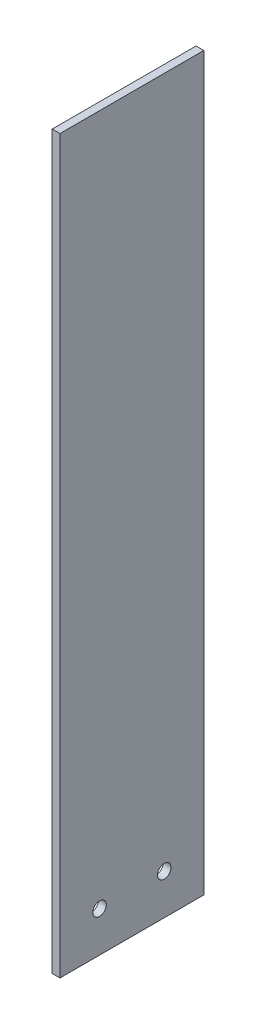
ISO-10303-21;
HEADER;
FILE_DESCRIPTION(('STEP AP214'),'2;1');
FILE_NAME('part.step','',(''),(''),'','','');
FILE_SCHEMA(('AUTOMOTIVE_DESIGN { 1 0 10303 214 1 1 1 1 }'));
ENDSEC;
DATA;
#1=APPLICATION_CONTEXT('core data for automotive mechanical design processes');
#2=APPLICATION_PROTOCOL_DEFINITION('international standard','automotive_design',2000,#1);
#3=PRODUCT_CONTEXT('',#1,'mechanical');
#4=PRODUCT('Part','Part','',(#3));
#5=PRODUCT_RELATED_PRODUCT_CATEGORY('part','',(#4));
#6=PRODUCT_DEFINITION_FORMATION('','',#4);
#7=PRODUCT_DEFINITION_CONTEXT('part definition',#1,'design');
#8=PRODUCT_DEFINITION('design','',#6,#7);
#9=PRODUCT_DEFINITION_SHAPE('','',#8);
#10=(LENGTH_UNIT() NAMED_UNIT(*) SI_UNIT(.MILLI.,.METRE.));
#11=(NAMED_UNIT(*) PLANE_ANGLE_UNIT() SI_UNIT($,.RADIAN.));
#12=(NAMED_UNIT(*) SI_UNIT($,.STERADIAN.) SOLID_ANGLE_UNIT());
#13=UNCERTAINTY_MEASURE_WITH_UNIT(LENGTH_MEASURE(1.E-05),#10,'distance_accuracy_value','');
#14=(GEOMETRIC_REPRESENTATION_CONTEXT(3) GLOBAL_UNCERTAINTY_ASSIGNED_CONTEXT((#13)) GLOBAL_UNIT_ASSIGNED_CONTEXT((#10,
#11,#12)) REPRESENTATION_CONTEXT('',''));
#15=CARTESIAN_POINT('',(0.,0.,0.));
#16=DIRECTION('',(0.,0.,1.));
#17=DIRECTION('',(1.,0.,0.));
#18=AXIS2_PLACEMENT_3D('',#15,#16,#17);
#19=CARTESIAN_POINT('',(3.048,143.51,-28.2194));
#20=DIRECTION('',(0.,0.,1.));
#21=DIRECTION('',(0.,-1.,0.));
#22=AXIS2_PLACEMENT_3D('',#19,#20,#21);
#23=PLANE('',#22);
#24=DIRECTION('',(0.,1.,0.));
#25=VECTOR('',#24,1.);
#26=CARTESIAN_POINT('',(0.,143.51,-28.2194));
#27=LINE('',#26,#25);
#28=CARTESIAN_POINT('',(0.,-143.51,-28.2194));
#29=VERTEX_POINT('',#28);
#30=CARTESIAN_POINT('',(0.,143.51,-28.2194));
#31=VERTEX_POINT('',#30);
#32=EDGE_CURVE('E107',#29,#31,#27,.T.);
#33=ORIENTED_EDGE('',*,*,#32,.T.);
#34=DIRECTION('',(-1.,0.,0.));
#35=VECTOR('',#34,1.);
#36=CARTESIAN_POINT('',(3.048,143.51,-28.2194));
#37=LINE('',#36,#35);
#38=CARTESIAN_POINT('',(3.048,143.51,-28.2194));
#39=VERTEX_POINT('',#38);
#40=EDGE_CURVE('E11',#39,#31,#37,.T.);
#41=ORIENTED_EDGE('',*,*,#40,.F.);
#42=DIRECTION('',(0.,1.,0.));
#43=VECTOR('',#42,1.);
#44=CARTESIAN_POINT('',(3.048,143.51,-28.2194));
#45=LINE('',#44,#43);
#46=CARTESIAN_POINT('',(3.048,-143.51,-28.2194));
#47=VERTEX_POINT('',#46);
#48=EDGE_CURVE('E91',#47,#39,#45,.T.);
#49=ORIENTED_EDGE('',*,*,#48,.F.);
#50=DIRECTION('',(-1.,0.,0.));
#51=VECTOR('',#50,1.);
#52=CARTESIAN_POINT('',(3.048,-143.51,-28.2194));
#53=LINE('',#52,#51);
#54=EDGE_CURVE('E103',#47,#29,#53,.T.);
#55=ORIENTED_EDGE('',*,*,#54,.T.);
#56=EDGE_LOOP('',(#33,#41,#49,#55));
#57=FACE_BOUND('',#56,.T.);
#58=ADVANCED_FACE('F39',(#57),#23,.F.);
#59=CARTESIAN_POINT('',(3.048,143.51,28.2194));
#60=DIRECTION('',(0.,-1.,0.));
#61=DIRECTION('',(0.,0.,-1.));
#62=AXIS2_PLACEMENT_3D('',#59,#60,#61);
#63=PLANE('',#62);
#64=DIRECTION('',(0.,0.,1.));
#65=VECTOR('',#64,1.);
#66=CARTESIAN_POINT('',(0.,143.51,28.2194));
#67=LINE('',#66,#65);
#68=CARTESIAN_POINT('',(0.,143.51,28.2194));
#69=VERTEX_POINT('',#68);
#70=EDGE_CURVE('E96',#31,#69,#67,.T.);
#71=ORIENTED_EDGE('',*,*,#70,.T.);
#72=DIRECTION('',(-1.,0.,0.));
#73=VECTOR('',#72,1.);
#74=CARTESIAN_POINT('',(3.048,143.51,28.2194));
#75=LINE('',#74,#73);
#76=CARTESIAN_POINT('',(3.048,143.51,28.2194));
#77=VERTEX_POINT('',#76);
#78=EDGE_CURVE('E48',#77,#69,#75,.T.);
#79=ORIENTED_EDGE('',*,*,#78,.F.);
#80=DIRECTION('',(0.,0.,1.));
#81=VECTOR('',#80,1.);
#82=CARTESIAN_POINT('',(3.048,143.51,28.2194));
#83=LINE('',#82,#81);
#84=EDGE_CURVE('E86',#39,#77,#83,.T.);
#85=ORIENTED_EDGE('',*,*,#84,.F.);
#86=ORIENTED_EDGE('',*,*,#40,.T.);
#87=EDGE_LOOP('',(#71,#79,#85,#86));
#88=FACE_BOUND('',#87,.T.);
#89=ADVANCED_FACE('F95',(#88),#63,.F.);
#90=CARTESIAN_POINT('',(3.048,143.51,28.2194));
#91=DIRECTION('',(0.,0.,-1.));
#92=DIRECTION('',(0.,1.,0.));
#93=AXIS2_PLACEMENT_3D('',#90,#91,#92);
#94=PLANE('',#93);
#95=DIRECTION('',(0.,-1.,0.));
#96=VECTOR('',#95,1.);
#97=CARTESIAN_POINT('',(0.,143.51,28.2194));
#98=LINE('',#97,#96);
#99=CARTESIAN_POINT('',(0.,-143.51,28.2194));
#100=VERTEX_POINT('',#99);
#101=EDGE_CURVE('E73',#69,#100,#98,.T.);
#102=ORIENTED_EDGE('',*,*,#101,.T.);
#103=DIRECTION('',(-1.,0.,0.));
#104=VECTOR('',#103,1.);
#105=CARTESIAN_POINT('',(3.048,-143.51,28.2194));
#106=LINE('',#105,#104);
#107=CARTESIAN_POINT('',(3.048,-143.51,28.2194));
#108=VERTEX_POINT('',#107);
#109=EDGE_CURVE('E98',#108,#100,#106,.T.);
#110=ORIENTED_EDGE('',*,*,#109,.F.);
#111=DIRECTION('',(0.,-1.,0.));
#112=VECTOR('',#111,1.);
#113=CARTESIAN_POINT('',(3.048,143.51,28.2194));
#114=LINE('',#113,#112);
#115=EDGE_CURVE('E89',#77,#108,#114,.T.);
#116=ORIENTED_EDGE('',*,*,#115,.F.);
#117=ORIENTED_EDGE('',*,*,#78,.T.);
#118=EDGE_LOOP('',(#102,#110,#116,#117));
#119=FACE_BOUND('',#118,.T.);
#120=ADVANCED_FACE('F99',(#119),#94,.F.);
#121=CARTESIAN_POINT('',(3.048,-143.51,28.2194));
#122=DIRECTION('',(0.,1.,0.));
#123=DIRECTION('',(0.,0.,1.));
#124=AXIS2_PLACEMENT_3D('',#121,#122,#123);
#125=PLANE('',#124);
#126=DIRECTION('',(0.,0.,-1.));
#127=VECTOR('',#126,1.);
#128=CARTESIAN_POINT('',(0.,-143.51,28.2194));
#129=LINE('',#128,#127);
#130=EDGE_CURVE('E79',#100,#29,#129,.T.);
#131=ORIENTED_EDGE('',*,*,#130,.T.);
#132=ORIENTED_EDGE('',*,*,#54,.F.);
#133=DIRECTION('',(0.,0.,-1.));
#134=VECTOR('',#133,1.);
#135=CARTESIAN_POINT('',(3.048,-143.51,28.2194));
#136=LINE('',#135,#134);
#137=EDGE_CURVE('E56',#108,#47,#136,.T.);
#138=ORIENTED_EDGE('',*,*,#137,.F.);
#139=ORIENTED_EDGE('',*,*,#109,.T.);
#140=EDGE_LOOP('',(#131,#132,#138,#139));
#141=FACE_BOUND('',#140,.T.);
#142=ADVANCED_FACE('F121',(#141),#125,.F.);
#143=CARTESIAN_POINT('',(3.048,0.,0.));
#144=DIRECTION('',(1.,0.,0.));
#145=DIRECTION('',(0.,0.,-1.));
#146=AXIS2_PLACEMENT_3D('',#143,#144,#145);
#147=PLANE('',#146);
#148=CARTESIAN_POINT('',(3.048,-127.7112,12.7));
#149=DIRECTION('',(1.,0.,0.));
#150=DIRECTION('',(0.,0.,-1.));
#151=AXIS2_PLACEMENT_3D('',#148,#149,#150);
#152=CIRCLE('',#151,2.6543);
#153=CARTESIAN_POINT('',(3.048,-127.7112,10.0457));
#154=VERTEX_POINT('',#153);
#155=EDGE_CURVE('E139',#154,#154,#152,.T.);
#156=ORIENTED_EDGE('',*,*,#155,.F.);
#157=EDGE_LOOP('',(#156));
#158=FACE_BOUND('',#157,.T.);
#159=CARTESIAN_POINT('',(3.048,-127.7112,-12.7));
#160=DIRECTION('',(1.,0.,0.));
#161=DIRECTION('',(0.,0.,-1.));
#162=AXIS2_PLACEMENT_3D('',#159,#160,#161);
#163=CIRCLE('',#162,2.6543);
#164=CARTESIAN_POINT('',(3.048,-127.7112,-15.3543));
#165=VERTEX_POINT('',#164);
#166=EDGE_CURVE('E131',#165,#165,#163,.T.);
#167=ORIENTED_EDGE('',*,*,#166,.F.);
#168=EDGE_LOOP('',(#167));
#169=FACE_BOUND('',#168,.T.);
#170=ORIENTED_EDGE('',*,*,#48,.T.);
#171=ORIENTED_EDGE('',*,*,#84,.T.);
#172=ORIENTED_EDGE('',*,*,#115,.T.);
#173=ORIENTED_EDGE('',*,*,#137,.T.);
#174=EDGE_LOOP('',(#170,#171,#172,#173));
#175=FACE_BOUND('',#174,.T.);
#176=ADVANCED_FACE('F87',(#158,#169,#175),#147,.T.);
#177=CARTESIAN_POINT('',(0.,0.,0.));
#178=DIRECTION('',(1.,0.,0.));
#179=DIRECTION('',(0.,0.,-1.));
#180=AXIS2_PLACEMENT_3D('',#177,#178,#179);
#181=PLANE('',#180);
#182=CARTESIAN_POINT('',(0.,-127.7112,12.7));
#183=DIRECTION('',(1.,0.,0.));
#184=DIRECTION('',(0.,0.,-1.));
#185=AXIS2_PLACEMENT_3D('',#182,#183,#184);
#186=CIRCLE('',#185,2.6543);
#187=CARTESIAN_POINT('',(0.,-127.7112,10.0457));
#188=VERTEX_POINT('',#187);
#189=EDGE_CURVE('E135',#188,#188,#186,.T.);
#190=ORIENTED_EDGE('',*,*,#189,.T.);
#191=EDGE_LOOP('',(#190));
#192=FACE_BOUND('',#191,.T.);
#193=CARTESIAN_POINT('',(0.,-127.7112,-12.7));
#194=DIRECTION('',(1.,0.,0.));
#195=DIRECTION('',(0.,0.,-1.));
#196=AXIS2_PLACEMENT_3D('',#193,#194,#195);
#197=CIRCLE('',#196,2.6543);
#198=CARTESIAN_POINT('',(0.,-127.7112,-15.3543));
#199=VERTEX_POINT('',#198);
#200=EDGE_CURVE('E111',#199,#199,#197,.T.);
#201=ORIENTED_EDGE('',*,*,#200,.T.);
#202=EDGE_LOOP('',(#201));
#203=FACE_BOUND('',#202,.T.);
#204=ORIENTED_EDGE('',*,*,#32,.F.);
#205=ORIENTED_EDGE('',*,*,#130,.F.);
#206=ORIENTED_EDGE('',*,*,#101,.F.);
#207=ORIENTED_EDGE('',*,*,#70,.F.);
#208=EDGE_LOOP('',(#204,#205,#206,#207));
#209=FACE_BOUND('',#208,.T.);
#210=ADVANCED_FACE('F124',(#192,#203,#209),#181,.F.);
#211=CARTESIAN_POINT('',(3.048,-127.7112,-12.7));
#212=DIRECTION('',(1.,0.,0.));
#213=DIRECTION('',(0.,0.,-1.));
#214=AXIS2_PLACEMENT_3D('',#211,#212,#213);
#215=CYLINDRICAL_SURFACE('',#214,2.6543);
#216=ORIENTED_EDGE('',*,*,#200,.F.);
#217=EDGE_LOOP('',(#216));
#218=FACE_BOUND('',#217,.T.);
#219=ORIENTED_EDGE('',*,*,#166,.T.);
#220=EDGE_LOOP('',(#219));
#221=FACE_BOUND('',#220,.T.);
#222=ADVANCED_FACE('F151',(#218,#221),#215,.F.);
#223=CARTESIAN_POINT('',(3.048,-127.7112,12.7));
#224=DIRECTION('',(1.,0.,0.));
#225=DIRECTION('',(0.,0.,-1.));
#226=AXIS2_PLACEMENT_3D('',#223,#224,#225);
#227=CYLINDRICAL_SURFACE('',#226,2.6543);
#228=ORIENTED_EDGE('',*,*,#189,.F.);
#229=EDGE_LOOP('',(#228));
#230=FACE_BOUND('',#229,.T.);
#231=ORIENTED_EDGE('',*,*,#155,.T.);
#232=EDGE_LOOP('',(#231));
#233=FACE_BOUND('',#232,.T.);
#234=ADVANCED_FACE('F144',(#230,#233),#227,.F.);
#235=CLOSED_SHELL('',(#58,#89,#120,#142,#176,#210,#222,#234));
#236=MANIFOLD_SOLID_BREP('B2',#235);
#237=ADVANCED_BREP_SHAPE_REPRESENTATION('',(#18,#236),#14);
#238=SHAPE_DEFINITION_REPRESENTATION(#9,#237);
ENDSEC;
END-ISO-10303-21;
